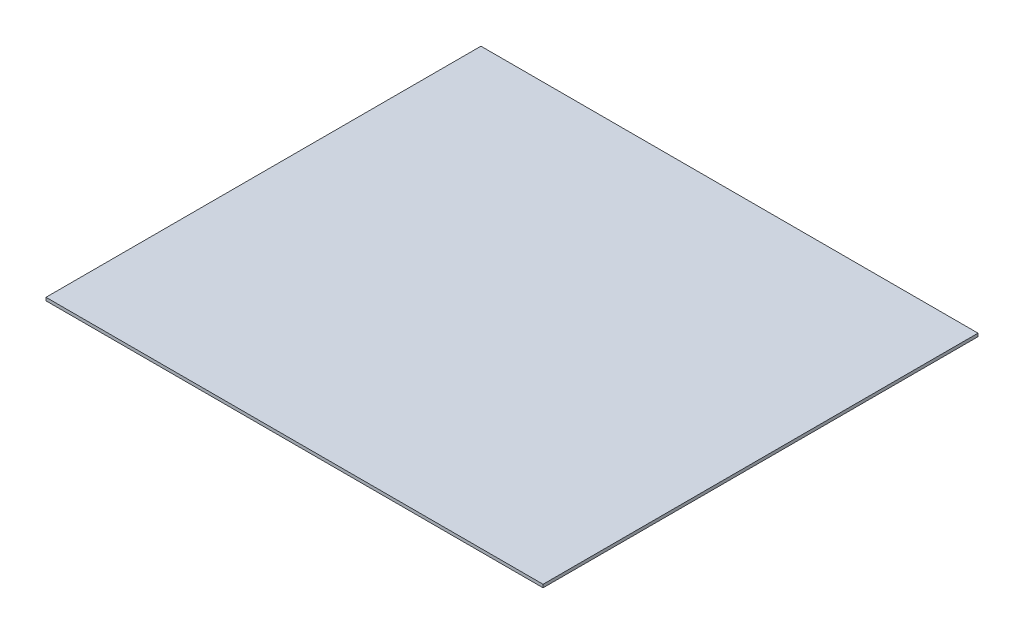
ISO-10303-21;
HEADER;
FILE_DESCRIPTION(('STEP AP214'),'2;1');
FILE_NAME('part.step','',(''),(''),'','','');
FILE_SCHEMA(('AUTOMOTIVE_DESIGN { 1 0 10303 214 1 1 1 1 }'));
ENDSEC;
DATA;
#1=APPLICATION_CONTEXT('core data for automotive mechanical design processes');
#2=APPLICATION_PROTOCOL_DEFINITION('international standard','automotive_design',2000,#1);
#3=PRODUCT_CONTEXT('',#1,'mechanical');
#4=PRODUCT('Part','Part','',(#3));
#5=PRODUCT_RELATED_PRODUCT_CATEGORY('part','',(#4));
#6=PRODUCT_DEFINITION_FORMATION('','',#4);
#7=PRODUCT_DEFINITION_CONTEXT('part definition',#1,'design');
#8=PRODUCT_DEFINITION('design','',#6,#7);
#9=PRODUCT_DEFINITION_SHAPE('','',#8);
#10=(LENGTH_UNIT() NAMED_UNIT(*) SI_UNIT(.MILLI.,.METRE.));
#11=(NAMED_UNIT(*) PLANE_ANGLE_UNIT() SI_UNIT($,.RADIAN.));
#12=(NAMED_UNIT(*) SI_UNIT($,.STERADIAN.) SOLID_ANGLE_UNIT());
#13=UNCERTAINTY_MEASURE_WITH_UNIT(LENGTH_MEASURE(1.E-05),#10,'distance_accuracy_value','');
#14=(GEOMETRIC_REPRESENTATION_CONTEXT(3) GLOBAL_UNCERTAINTY_ASSIGNED_CONTEXT((#13)) GLOBAL_UNIT_ASSIGNED_CONTEXT((#10,
#11,#12)) REPRESENTATION_CONTEXT('',''));
#15=CARTESIAN_POINT('',(0.,0.,0.));
#16=DIRECTION('',(0.,0.,1.));
#17=DIRECTION('',(1.,0.,0.));
#18=AXIS2_PLACEMENT_3D('',#15,#16,#17);
#19=CARTESIAN_POINT('',(80.,1.,70.));
#20=DIRECTION('',(-1.,0.,0.));
#21=DIRECTION('',(0.,0.,1.));
#22=AXIS2_PLACEMENT_3D('',#19,#20,#21);
#23=PLANE('',#22);
#24=DIRECTION('',(0.,0.,-1.));
#25=VECTOR('',#24,1.);
#26=CARTESIAN_POINT('',(80.,0.,70.));
#27=LINE('',#26,#25);
#28=CARTESIAN_POINT('',(80.,0.,70.));
#29=VERTEX_POINT('',#28);
#30=CARTESIAN_POINT('',(80.,0.,-70.));
#31=VERTEX_POINT('',#30);
#32=EDGE_CURVE('E107',#29,#31,#27,.T.);
#33=ORIENTED_EDGE('',*,*,#32,.T.);
#34=DIRECTION('',(0.,-1.,0.));
#35=VECTOR('',#34,1.);
#36=CARTESIAN_POINT('',(80.,1.,-70.));
#37=LINE('',#36,#35);
#38=CARTESIAN_POINT('',(80.,1.,-70.));
#39=VERTEX_POINT('',#38);
#40=EDGE_CURVE('E11',#39,#31,#37,.T.);
#41=ORIENTED_EDGE('',*,*,#40,.F.);
#42=DIRECTION('',(0.,0.,-1.));
#43=VECTOR('',#42,1.);
#44=CARTESIAN_POINT('',(80.,1.,70.));
#45=LINE('',#44,#43);
#46=CARTESIAN_POINT('',(80.,1.,70.));
#47=VERTEX_POINT('',#46);
#48=EDGE_CURVE('E91',#47,#39,#45,.T.);
#49=ORIENTED_EDGE('',*,*,#48,.F.);
#50=DIRECTION('',(0.,-1.,0.));
#51=VECTOR('',#50,1.);
#52=CARTESIAN_POINT('',(80.,1.,70.));
#53=LINE('',#52,#51);
#54=EDGE_CURVE('E103',#47,#29,#53,.T.);
#55=ORIENTED_EDGE('',*,*,#54,.T.);
#56=EDGE_LOOP('',(#33,#41,#49,#55));
#57=FACE_BOUND('',#56,.T.);
#58=ADVANCED_FACE('F39',(#57),#23,.F.);
#59=CARTESIAN_POINT('',(-80.,1.,-70.));
#60=DIRECTION('',(0.,0.,1.));
#61=DIRECTION('',(1.,0.,0.));
#62=AXIS2_PLACEMENT_3D('',#59,#60,#61);
#63=PLANE('',#62);
#64=DIRECTION('',(-1.,0.,0.));
#65=VECTOR('',#64,1.);
#66=CARTESIAN_POINT('',(-80.,0.,-70.));
#67=LINE('',#66,#65);
#68=CARTESIAN_POINT('',(-80.,0.,-70.));
#69=VERTEX_POINT('',#68);
#70=EDGE_CURVE('E96',#31,#69,#67,.T.);
#71=ORIENTED_EDGE('',*,*,#70,.T.);
#72=DIRECTION('',(0.,-1.,0.));
#73=VECTOR('',#72,1.);
#74=CARTESIAN_POINT('',(-80.,1.,-70.));
#75=LINE('',#74,#73);
#76=CARTESIAN_POINT('',(-80.,1.,-70.));
#77=VERTEX_POINT('',#76);
#78=EDGE_CURVE('E48',#77,#69,#75,.T.);
#79=ORIENTED_EDGE('',*,*,#78,.F.);
#80=DIRECTION('',(-1.,0.,0.));
#81=VECTOR('',#80,1.);
#82=CARTESIAN_POINT('',(-80.,1.,-70.));
#83=LINE('',#82,#81);
#84=EDGE_CURVE('E86',#39,#77,#83,.T.);
#85=ORIENTED_EDGE('',*,*,#84,.F.);
#86=ORIENTED_EDGE('',*,*,#40,.T.);
#87=EDGE_LOOP('',(#71,#79,#85,#86));
#88=FACE_BOUND('',#87,.T.);
#89=ADVANCED_FACE('F95',(#88),#63,.F.);
#90=CARTESIAN_POINT('',(-80.,1.,70.));
#91=DIRECTION('',(1.,0.,0.));
#92=DIRECTION('',(0.,0.,-1.));
#93=AXIS2_PLACEMENT_3D('',#90,#91,#92);
#94=PLANE('',#93);
#95=DIRECTION('',(0.,0.,1.));
#96=VECTOR('',#95,1.);
#97=CARTESIAN_POINT('',(-80.,0.,70.));
#98=LINE('',#97,#96);
#99=CARTESIAN_POINT('',(-80.,0.,70.));
#100=VERTEX_POINT('',#99);
#101=EDGE_CURVE('E73',#69,#100,#98,.T.);
#102=ORIENTED_EDGE('',*,*,#101,.T.);
#103=DIRECTION('',(0.,-1.,0.));
#104=VECTOR('',#103,1.);
#105=CARTESIAN_POINT('',(-80.,1.,70.));
#106=LINE('',#105,#104);
#107=CARTESIAN_POINT('',(-80.,1.,70.));
#108=VERTEX_POINT('',#107);
#109=EDGE_CURVE('E98',#108,#100,#106,.T.);
#110=ORIENTED_EDGE('',*,*,#109,.F.);
#111=DIRECTION('',(0.,0.,1.));
#112=VECTOR('',#111,1.);
#113=CARTESIAN_POINT('',(-80.,1.,70.));
#114=LINE('',#113,#112);
#115=EDGE_CURVE('E89',#77,#108,#114,.T.);
#116=ORIENTED_EDGE('',*,*,#115,.F.);
#117=ORIENTED_EDGE('',*,*,#78,.T.);
#118=EDGE_LOOP('',(#102,#110,#116,#117));
#119=FACE_BOUND('',#118,.T.);
#120=ADVANCED_FACE('F99',(#119),#94,.F.);
#121=CARTESIAN_POINT('',(-80.,1.,70.));
#122=DIRECTION('',(0.,0.,-1.));
#123=DIRECTION('',(-1.,0.,0.));
#124=AXIS2_PLACEMENT_3D('',#121,#122,#123);
#125=PLANE('',#124);
#126=DIRECTION('',(1.,0.,0.));
#127=VECTOR('',#126,1.);
#128=CARTESIAN_POINT('',(-80.,0.,70.));
#129=LINE('',#128,#127);
#130=EDGE_CURVE('E79',#100,#29,#129,.T.);
#131=ORIENTED_EDGE('',*,*,#130,.T.);
#132=ORIENTED_EDGE('',*,*,#54,.F.);
#133=DIRECTION('',(1.,0.,0.));
#134=VECTOR('',#133,1.);
#135=CARTESIAN_POINT('',(-80.,1.,70.));
#136=LINE('',#135,#134);
#137=EDGE_CURVE('E56',#108,#47,#136,.T.);
#138=ORIENTED_EDGE('',*,*,#137,.F.);
#139=ORIENTED_EDGE('',*,*,#109,.T.);
#140=EDGE_LOOP('',(#131,#132,#138,#139));
#141=FACE_BOUND('',#140,.T.);
#142=ADVANCED_FACE('F120',(#141),#125,.F.);
#143=CARTESIAN_POINT('',(0.,1.,0.));
#144=DIRECTION('',(0.,-1.,0.));
#145=DIRECTION('',(0.,0.,-1.));
#146=AXIS2_PLACEMENT_3D('',#143,#144,#145);
#147=PLANE('',#146);
#148=ORIENTED_EDGE('',*,*,#48,.T.);
#149=ORIENTED_EDGE('',*,*,#84,.T.);
#150=ORIENTED_EDGE('',*,*,#115,.T.);
#151=ORIENTED_EDGE('',*,*,#137,.T.);
#152=EDGE_LOOP('',(#148,#149,#150,#151));
#153=FACE_BOUND('',#152,.T.);
#154=ADVANCED_FACE('F87',(#153),#147,.F.);
#155=CARTESIAN_POINT('',(0.,0.,0.));
#156=DIRECTION('',(0.,-1.,0.));
#157=DIRECTION('',(0.,0.,-1.));
#158=AXIS2_PLACEMENT_3D('',#155,#156,#157);
#159=PLANE('',#158);
#160=ORIENTED_EDGE('',*,*,#32,.F.);
#161=ORIENTED_EDGE('',*,*,#130,.F.);
#162=ORIENTED_EDGE('',*,*,#101,.F.);
#163=ORIENTED_EDGE('',*,*,#70,.F.);
#164=EDGE_LOOP('',(#160,#161,#162,#163));
#165=FACE_BOUND('',#164,.T.);
#166=ADVANCED_FACE('F123',(#165),#159,.T.);
#167=CLOSED_SHELL('',(#58,#89,#120,#142,#154,#166));
#168=MANIFOLD_SOLID_BREP('B2',#167);
#169=ADVANCED_BREP_SHAPE_REPRESENTATION('',(#18,#168),#14);
#170=SHAPE_DEFINITION_REPRESENTATION(#9,#169);
ENDSEC;
END-ISO-10303-21;
